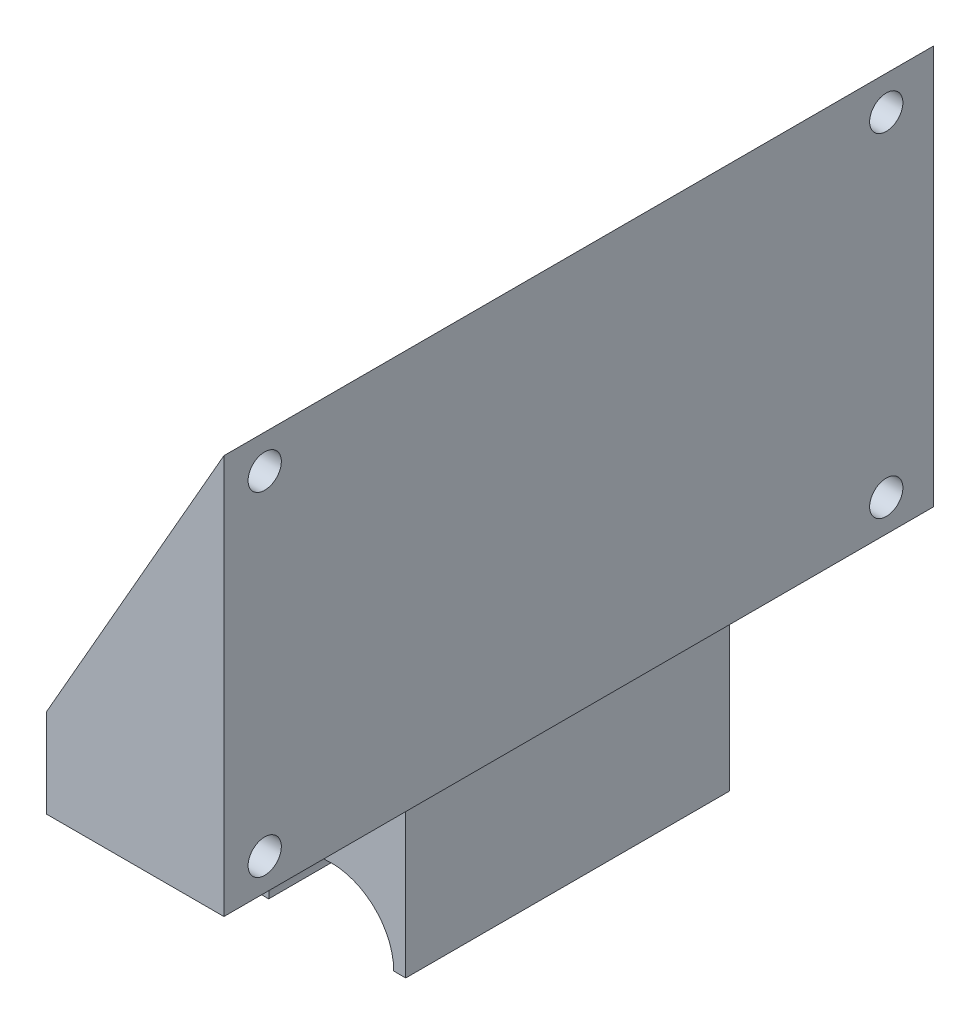
ISO-10303-21;
HEADER;
FILE_DESCRIPTION(('STEP AP214'),'2;1');
FILE_NAME('part.step','',(''),(''),'','','');
FILE_SCHEMA(('AUTOMOTIVE_DESIGN { 1 0 10303 214 1 1 1 1 }'));
ENDSEC;
DATA;
#1=APPLICATION_CONTEXT('core data for automotive mechanical design processes');
#2=APPLICATION_PROTOCOL_DEFINITION('international standard','automotive_design',2000,#1);
#3=PRODUCT_CONTEXT('',#1,'mechanical');
#4=PRODUCT('Part','Part','',(#3));
#5=PRODUCT_RELATED_PRODUCT_CATEGORY('part','',(#4));
#6=PRODUCT_DEFINITION_FORMATION('','',#4);
#7=PRODUCT_DEFINITION_CONTEXT('part definition',#1,'design');
#8=PRODUCT_DEFINITION('design','',#6,#7);
#9=PRODUCT_DEFINITION_SHAPE('','',#8);
#10=(LENGTH_UNIT() NAMED_UNIT(*) SI_UNIT(.MILLI.,.METRE.));
#11=(NAMED_UNIT(*) PLANE_ANGLE_UNIT() SI_UNIT($,.RADIAN.));
#12=(NAMED_UNIT(*) SI_UNIT($,.STERADIAN.) SOLID_ANGLE_UNIT());
#13=UNCERTAINTY_MEASURE_WITH_UNIT(LENGTH_MEASURE(1.E-05),#10,'distance_accuracy_value','');
#14=(GEOMETRIC_REPRESENTATION_CONTEXT(3) GLOBAL_UNCERTAINTY_ASSIGNED_CONTEXT((#13)) GLOBAL_UNIT_ASSIGNED_CONTEXT((#10,
#11,#12)) REPRESENTATION_CONTEXT('',''));
#15=CARTESIAN_POINT('',(0.,0.,0.));
#16=DIRECTION('',(0.,0.,1.));
#17=DIRECTION('',(1.,0.,0.));
#18=AXIS2_PLACEMENT_3D('',#15,#16,#17);
#19=CARTESIAN_POINT('',(0.,-22.225,0.));
#20=DIRECTION('',(0.,1.,0.));
#21=DIRECTION('',(0.,0.,1.));
#22=AXIS2_PLACEMENT_3D('',#19,#20,#21);
#23=PLANE('',#22);
#24=DIRECTION('',(0.,0.,1.));
#25=VECTOR('',#24,1.);
#26=CARTESIAN_POINT('',(22.098,-22.225,-330.709604062188));
#27=LINE('',#26,#25);
#28=CARTESIAN_POINT('',(22.098,-22.225,-73.9775));
#29=VERTEX_POINT('',#28);
#30=CARTESIAN_POINT('',(22.098,-22.225,-27.6225));
#31=VERTEX_POINT('',#30);
#32=EDGE_CURVE('E116',#29,#31,#27,.T.);
#33=ORIENTED_EDGE('',*,*,#32,.F.);
#34=DIRECTION('',(1.,0.,0.));
#35=VECTOR('',#34,1.);
#36=CARTESIAN_POINT('',(23.8125,-22.225,-73.9775));
#37=LINE('',#36,#35);
#38=CARTESIAN_POINT('',(23.8125,-22.225,-73.9775));
#39=VERTEX_POINT('',#38);
#40=EDGE_CURVE('E143',#29,#39,#37,.T.);
#41=ORIENTED_EDGE('',*,*,#40,.T.);
#42=DIRECTION('',(0.,0.,1.));
#43=VECTOR('',#42,1.);
#44=CARTESIAN_POINT('',(23.8125,-22.225,-27.6225));
#45=LINE('',#44,#43);
#46=CARTESIAN_POINT('',(23.8125,-22.225,-27.6225));
#47=VERTEX_POINT('',#46);
#48=EDGE_CURVE('E135',#39,#47,#45,.T.);
#49=ORIENTED_EDGE('',*,*,#48,.T.);
#50=DIRECTION('',(-1.,0.,0.));
#51=VECTOR('',#50,1.);
#52=CARTESIAN_POINT('',(23.8125,-22.225,-27.6225));
#53=LINE('',#52,#51);
#54=EDGE_CURVE('E134',#47,#31,#53,.T.);
#55=ORIENTED_EDGE('',*,*,#54,.T.);
#56=EDGE_LOOP('',(#33,#41,#49,#55));
#57=FACE_BOUND('',#56,.T.);
#58=ADVANCED_FACE('F39',(#57),#23,.F.);
#59=CARTESIAN_POINT('',(0.,0.,-101.6));
#60=DIRECTION('',(-1.,0.,0.));
#61=DIRECTION('',(0.,0.,1.));
#62=AXIS2_PLACEMENT_3D('',#59,#60,#61);
#63=PLANE('',#62);
#64=CARTESIAN_POINT('',(0.,4.572,-94.837878374074));
#65=DIRECTION('',(1.,0.,0.));
#66=DIRECTION('',(0.,1.,0.));
#67=AXIS2_PLACEMENT_3D('',#64,#65,#66);
#68=CIRCLE('',#67,2.38125000000001);
#69=CARTESIAN_POINT('',(0.,6.95325,-94.837878374074));
#70=VERTEX_POINT('',#69);
#71=EDGE_CURVE('E404',#70,#70,#68,.T.);
#72=ORIENTED_EDGE('',*,*,#71,.T.);
#73=EDGE_LOOP('',(#72));
#74=FACE_BOUND('',#73,.T.);
#75=CARTESIAN_POINT('',(0.,4.572,-5.842));
#76=DIRECTION('',(1.,0.,0.));
#77=DIRECTION('',(0.,1.,0.));
#78=AXIS2_PLACEMENT_3D('',#75,#76,#77);
#79=CIRCLE('',#78,2.38125);
#80=CARTESIAN_POINT('',(0.,6.95325,-5.842));
#81=VERTEX_POINT('',#80);
#82=EDGE_CURVE('E425',#81,#81,#79,.T.);
#83=ORIENTED_EDGE('',*,*,#82,.T.);
#84=EDGE_LOOP('',(#83));
#85=FACE_BOUND('',#84,.T.);
#86=DIRECTION('',(0.,-1.,0.));
#87=VECTOR('',#86,1.);
#88=CARTESIAN_POINT('',(0.,0.,0.));
#89=LINE('',#88,#87);
#90=CARTESIAN_POINT('',(0.,12.7,0.));
#91=VERTEX_POINT('',#90);
#92=CARTESIAN_POINT('',(0.,0.,0.));
#93=VERTEX_POINT('',#92);
#94=EDGE_CURVE('E162',#91,#93,#89,.T.);
#95=ORIENTED_EDGE('',*,*,#94,.F.);
#96=DIRECTION('',(0.,0.,1.));
#97=VECTOR('',#96,1.);
#98=CARTESIAN_POINT('',(0.,12.7,-101.6));
#99=LINE('',#98,#97);
#100=CARTESIAN_POINT('',(0.,12.7,-101.6));
#101=VERTEX_POINT('',#100);
#102=EDGE_CURVE('E47',#101,#91,#99,.T.);
#103=ORIENTED_EDGE('',*,*,#102,.F.);
#104=DIRECTION('',(0.,-1.,0.));
#105=VECTOR('',#104,1.);
#106=CARTESIAN_POINT('',(0.,0.,-101.6));
#107=LINE('',#106,#105);
#108=CARTESIAN_POINT('',(0.,0.,-101.6));
#109=VERTEX_POINT('',#108);
#110=EDGE_CURVE('E163',#101,#109,#107,.T.);
#111=ORIENTED_EDGE('',*,*,#110,.T.);
#112=DIRECTION('',(0.,0.,1.));
#113=VECTOR('',#112,1.);
#114=CARTESIAN_POINT('',(0.,0.,-101.6));
#115=LINE('',#114,#113);
#116=EDGE_CURVE('E176',#109,#93,#115,.T.);
#117=ORIENTED_EDGE('',*,*,#116,.T.);
#118=EDGE_LOOP('',(#95,#103,#111,#117));
#119=FACE_BOUND('',#118,.T.);
#120=ADVANCED_FACE('F41',(#74,#85,#119),#63,.T.);
#121=CARTESIAN_POINT('',(25.4,57.15,-101.6));
#122=DIRECTION('',(-0.868243142124459,0.496138938356834,0.));
#123=DIRECTION('',(-0.496138938356834,-0.868243142124459,0.));
#124=AXIS2_PLACEMENT_3D('',#121,#122,#123);
#125=PLANE('',#124);
#126=CARTESIAN_POINT('',(22.6422857142857,52.324,-94.837878374074));
#127=DIRECTION('',(-0.868243142124459,0.496138938356834,0.));
#128=DIRECTION('',(0.496138938356834,0.868243142124459,0.));
#129=AXIS2_PLACEMENT_3D('',#126,#127,#128);
#130=ELLIPSE('',#129,2.74260732330514,2.38125);
#131=CARTESIAN_POINT('',(24.003,54.70525,-94.837878374074));
#132=VERTEX_POINT('',#131);
#133=EDGE_CURVE('E401',#132,#132,#130,.T.);
#134=ORIENTED_EDGE('',*,*,#133,.F.);
#135=EDGE_LOOP('',(#134));
#136=FACE_BOUND('',#135,.T.);
#137=CARTESIAN_POINT('',(22.6422857142857,52.324,-5.842));
#138=DIRECTION('',(-0.868243142124459,0.496138938356834,0.));
#139=DIRECTION('',(0.496138938356834,0.868243142124459,0.));
#140=AXIS2_PLACEMENT_3D('',#137,#138,#139);
#141=ELLIPSE('',#140,2.74260732330513,2.38125);
#142=CARTESIAN_POINT('',(24.003,54.70525,-5.842));
#143=VERTEX_POINT('',#142);
#144=EDGE_CURVE('E414',#143,#143,#141,.T.);
#145=ORIENTED_EDGE('',*,*,#144,.F.);
#146=EDGE_LOOP('',(#145));
#147=FACE_BOUND('',#146,.T.);
#148=DIRECTION('',(-0.496138938356834,-0.868243142124459,0.));
#149=VECTOR('',#148,1.);
#150=CARTESIAN_POINT('',(25.4,57.15,0.));
#151=LINE('',#150,#149);
#152=CARTESIAN_POINT('',(25.4,57.15,0.));
#153=VERTEX_POINT('',#152);
#154=EDGE_CURVE('E167',#153,#91,#151,.T.);
#155=ORIENTED_EDGE('',*,*,#154,.F.);
#156=DIRECTION('',(0.,0.,1.));
#157=VECTOR('',#156,1.);
#158=CARTESIAN_POINT('',(25.4,57.15,-101.6));
#159=LINE('',#158,#157);
#160=CARTESIAN_POINT('',(25.4,57.15,-101.6));
#161=VERTEX_POINT('',#160);
#162=EDGE_CURVE('E188',#161,#153,#159,.T.);
#163=ORIENTED_EDGE('',*,*,#162,.F.);
#164=DIRECTION('',(-0.496138938356834,-0.868243142124459,0.));
#165=VECTOR('',#164,1.);
#166=CARTESIAN_POINT('',(25.4,57.15,-101.6));
#167=LINE('',#166,#165);
#168=EDGE_CURVE('E173',#161,#101,#167,.T.);
#169=ORIENTED_EDGE('',*,*,#168,.T.);
#170=ORIENTED_EDGE('',*,*,#102,.T.);
#171=EDGE_LOOP('',(#155,#163,#169,#170));
#172=FACE_BOUND('',#171,.T.);
#173=ADVANCED_FACE('F203',(#136,#147,#172),#125,.T.);
#174=CARTESIAN_POINT('',(25.4,57.15,-101.6));
#175=DIRECTION('',(1.,0.,0.));
#176=DIRECTION('',(0.,1.,0.));
#177=AXIS2_PLACEMENT_3D('',#174,#175,#176);
#178=PLANE('',#177);
#179=CARTESIAN_POINT('',(25.4,52.324,-94.837878374074));
#180=DIRECTION('',(1.,0.,0.));
#181=DIRECTION('',(0.,1.,0.));
#182=AXIS2_PLACEMENT_3D('',#179,#180,#181);
#183=CIRCLE('',#182,2.38125);
#184=CARTESIAN_POINT('',(25.4,54.70525,-94.837878374074));
#185=VERTEX_POINT('',#184);
#186=EDGE_CURVE('E403',#185,#185,#183,.T.);
#187=ORIENTED_EDGE('',*,*,#186,.F.);
#188=EDGE_LOOP('',(#187));
#189=FACE_BOUND('',#188,.T.);
#190=CARTESIAN_POINT('',(25.4,4.572,-94.837878374074));
#191=DIRECTION('',(1.,0.,0.));
#192=DIRECTION('',(0.,1.,0.));
#193=AXIS2_PLACEMENT_3D('',#190,#191,#192);
#194=CIRCLE('',#193,2.38125000000001);
#195=CARTESIAN_POINT('',(25.4,6.95325,-94.837878374074));
#196=VERTEX_POINT('',#195);
#197=EDGE_CURVE('E407',#196,#196,#194,.T.);
#198=ORIENTED_EDGE('',*,*,#197,.F.);
#199=EDGE_LOOP('',(#198));
#200=FACE_BOUND('',#199,.T.);
#201=CARTESIAN_POINT('',(25.4,4.572,-5.842));
#202=DIRECTION('',(1.,0.,0.));
#203=DIRECTION('',(0.,1.,0.));
#204=AXIS2_PLACEMENT_3D('',#201,#202,#203);
#205=CIRCLE('',#204,2.38125);
#206=CARTESIAN_POINT('',(25.4,6.95325,-5.842));
#207=VERTEX_POINT('',#206);
#208=EDGE_CURVE('E415',#207,#207,#205,.T.);
#209=ORIENTED_EDGE('',*,*,#208,.F.);
#210=EDGE_LOOP('',(#209));
#211=FACE_BOUND('',#210,.T.);
#212=CARTESIAN_POINT('',(25.4,52.324,-5.842));
#213=DIRECTION('',(1.,0.,0.));
#214=DIRECTION('',(0.,1.,0.));
#215=AXIS2_PLACEMENT_3D('',#212,#213,#214);
#216=CIRCLE('',#215,2.38125);
#217=CARTESIAN_POINT('',(25.4,54.70525,-5.842));
#218=VERTEX_POINT('',#217);
#219=EDGE_CURVE('E411',#218,#218,#216,.T.);
#220=ORIENTED_EDGE('',*,*,#219,.F.);
#221=EDGE_LOOP('',(#220));
#222=FACE_BOUND('',#221,.T.);
#223=DIRECTION('',(0.,1.,0.));
#224=VECTOR('',#223,1.);
#225=CARTESIAN_POINT('',(25.4,57.15,0.));
#226=LINE('',#225,#224);
#227=CARTESIAN_POINT('',(25.4,0.,0.));
#228=VERTEX_POINT('',#227);
#229=EDGE_CURVE('E182',#228,#153,#226,.T.);
#230=ORIENTED_EDGE('',*,*,#229,.F.);
#231=DIRECTION('',(0.,0.,1.));
#232=VECTOR('',#231,1.);
#233=CARTESIAN_POINT('',(25.4,0.,-101.6));
#234=LINE('',#233,#232);
#235=CARTESIAN_POINT('',(25.4,0.,-101.6));
#236=VERTEX_POINT('',#235);
#237=EDGE_CURVE('E190',#236,#228,#234,.T.);
#238=ORIENTED_EDGE('',*,*,#237,.F.);
#239=DIRECTION('',(0.,1.,0.));
#240=VECTOR('',#239,1.);
#241=CARTESIAN_POINT('',(25.4,57.15,-101.6));
#242=LINE('',#241,#240);
#243=EDGE_CURVE('E170',#236,#161,#242,.T.);
#244=ORIENTED_EDGE('',*,*,#243,.T.);
#245=ORIENTED_EDGE('',*,*,#162,.T.);
#246=EDGE_LOOP('',(#230,#238,#244,#245));
#247=FACE_BOUND('',#246,.T.);
#248=ADVANCED_FACE('F209',(#189,#200,#211,#222,#247),#178,.T.);
#249=CARTESIAN_POINT('',(0.,0.,-101.6));
#250=DIRECTION('',(0.,-1.,0.));
#251=DIRECTION('',(0.,0.,-1.));
#252=AXIS2_PLACEMENT_3D('',#249,#250,#251);
#253=PLANE('',#252);
#254=DIRECTION('',(0.,0.,1.));
#255=VECTOR('',#254,1.);
#256=CARTESIAN_POINT('',(23.8125,0.,-27.6225));
#257=LINE('',#256,#255);
#258=CARTESIAN_POINT('',(23.8125,0.,-73.9775));
#259=VERTEX_POINT('',#258);
#260=CARTESIAN_POINT('',(23.8125,0.,-27.6225));
#261=VERTEX_POINT('',#260);
#262=EDGE_CURVE('E61',#259,#261,#257,.T.);
#263=ORIENTED_EDGE('',*,*,#262,.F.);
#264=DIRECTION('',(1.,0.,0.));
#265=VECTOR('',#264,1.);
#266=CARTESIAN_POINT('',(23.8125,0.,-73.9775));
#267=LINE('',#266,#265);
#268=CARTESIAN_POINT('',(2.4765,0.,-73.9775));
#269=VERTEX_POINT('',#268);
#270=EDGE_CURVE('E139',#269,#259,#267,.T.);
#271=ORIENTED_EDGE('',*,*,#270,.F.);
#272=DIRECTION('',(0.,0.,-1.));
#273=VECTOR('',#272,1.);
#274=CARTESIAN_POINT('',(2.4765,0.,-27.6225));
#275=LINE('',#274,#273);
#276=CARTESIAN_POINT('',(2.4765,0.,-27.6225));
#277=VERTEX_POINT('',#276);
#278=EDGE_CURVE('E149',#277,#269,#275,.T.);
#279=ORIENTED_EDGE('',*,*,#278,.F.);
#280=DIRECTION('',(-1.,0.,0.));
#281=VECTOR('',#280,1.);
#282=CARTESIAN_POINT('',(23.8125,0.,-27.6225));
#283=LINE('',#282,#281);
#284=EDGE_CURVE('E147',#261,#277,#283,.T.);
#285=ORIENTED_EDGE('',*,*,#284,.F.);
#286=EDGE_LOOP('',(#263,#271,#279,#285));
#287=FACE_BOUND('',#286,.T.);
#288=DIRECTION('',(1.,0.,0.));
#289=VECTOR('',#288,1.);
#290=CARTESIAN_POINT('',(0.,0.,0.));
#291=LINE('',#290,#289);
#292=EDGE_CURVE('E179',#93,#228,#291,.T.);
#293=ORIENTED_EDGE('',*,*,#292,.F.);
#294=ORIENTED_EDGE('',*,*,#116,.F.);
#295=DIRECTION('',(1.,0.,0.));
#296=VECTOR('',#295,1.);
#297=CARTESIAN_POINT('',(0.,0.,-101.6));
#298=LINE('',#297,#296);
#299=EDGE_CURVE('E166',#109,#236,#298,.T.);
#300=ORIENTED_EDGE('',*,*,#299,.T.);
#301=ORIENTED_EDGE('',*,*,#237,.T.);
#302=EDGE_LOOP('',(#293,#294,#300,#301));
#303=FACE_BOUND('',#302,.T.);
#304=ADVANCED_FACE('F197',(#287,#303),#253,.T.);
#305=CARTESIAN_POINT('',(0.,0.,-101.6));
#306=DIRECTION('',(0.,0.,-1.));
#307=DIRECTION('',(-1.,0.,0.));
#308=AXIS2_PLACEMENT_3D('',#305,#306,#307);
#309=PLANE('',#308);
#310=ORIENTED_EDGE('',*,*,#110,.F.);
#311=ORIENTED_EDGE('',*,*,#168,.F.);
#312=ORIENTED_EDGE('',*,*,#243,.F.);
#313=ORIENTED_EDGE('',*,*,#299,.F.);
#314=EDGE_LOOP('',(#310,#311,#312,#313));
#315=FACE_BOUND('',#314,.T.);
#316=ADVANCED_FACE('F206',(#315),#309,.T.);
#317=CARTESIAN_POINT('',(0.,0.,0.));
#318=DIRECTION('',(0.,0.,-1.));
#319=DIRECTION('',(-1.,0.,0.));
#320=AXIS2_PLACEMENT_3D('',#317,#318,#319);
#321=PLANE('',#320);
#322=ORIENTED_EDGE('',*,*,#94,.T.);
#323=ORIENTED_EDGE('',*,*,#292,.T.);
#324=ORIENTED_EDGE('',*,*,#229,.T.);
#325=ORIENTED_EDGE('',*,*,#154,.T.);
#326=EDGE_LOOP('',(#322,#323,#324,#325));
#327=FACE_BOUND('',#326,.T.);
#328=ADVANCED_FACE('F200',(#327),#321,.F.);
#329=CARTESIAN_POINT('',(23.8125,-22.225,-27.6225));
#330=DIRECTION('',(-1.,0.,0.));
#331=DIRECTION('',(0.,0.,1.));
#332=AXIS2_PLACEMENT_3D('',#329,#330,#331);
#333=PLANE('',#332);
#334=ORIENTED_EDGE('',*,*,#262,.T.);
#335=DIRECTION('',(0.,1.,0.));
#336=VECTOR('',#335,1.);
#337=CARTESIAN_POINT('',(23.8125,-22.225,-27.6225));
#338=LINE('',#337,#336);
#339=EDGE_CURVE('E159',#47,#261,#338,.T.);
#340=ORIENTED_EDGE('',*,*,#339,.F.);
#341=ORIENTED_EDGE('',*,*,#48,.F.);
#342=DIRECTION('',(0.,1.,0.));
#343=VECTOR('',#342,1.);
#344=CARTESIAN_POINT('',(23.8125,-22.225,-73.9775));
#345=LINE('',#344,#343);
#346=EDGE_CURVE('E145',#39,#259,#345,.T.);
#347=ORIENTED_EDGE('',*,*,#346,.T.);
#348=EDGE_LOOP('',(#334,#340,#341,#347));
#349=FACE_BOUND('',#348,.T.);
#350=ADVANCED_FACE('F250',(#349),#333,.F.);
#351=CARTESIAN_POINT('',(23.8125,-22.225,-27.6225));
#352=DIRECTION('',(0.,0.,-1.));
#353=DIRECTION('',(-1.,0.,0.));
#354=AXIS2_PLACEMENT_3D('',#351,#352,#353);
#355=PLANE('',#354);
#356=CARTESIAN_POINT('',(4.191,-22.225,-27.6225));
#357=VERTEX_POINT('',#356);
#358=CARTESIAN_POINT('',(2.4765,-22.225,-27.6225));
#359=VERTEX_POINT('',#358);
#360=EDGE_CURVE('E124',#357,#359,#53,.T.);
#361=ORIENTED_EDGE('',*,*,#360,.F.);
#362=CARTESIAN_POINT('',(13.1445,-22.225,-27.6225));
#363=DIRECTION('',(0.,0.,-1.));
#364=DIRECTION('',(-1.,0.,0.));
#365=AXIS2_PLACEMENT_3D('',#362,#363,#364);
#366=CIRCLE('',#365,8.9535);
#367=EDGE_CURVE('E113',#357,#31,#366,.T.);
#368=ORIENTED_EDGE('',*,*,#367,.T.);
#369=ORIENTED_EDGE('',*,*,#54,.F.);
#370=ORIENTED_EDGE('',*,*,#339,.T.);
#371=ORIENTED_EDGE('',*,*,#284,.T.);
#372=DIRECTION('',(0.,1.,0.));
#373=VECTOR('',#372,1.);
#374=CARTESIAN_POINT('',(2.4765,-22.225,-27.6225));
#375=LINE('',#374,#373);
#376=EDGE_CURVE('E132',#359,#277,#375,.T.);
#377=ORIENTED_EDGE('',*,*,#376,.F.);
#378=EDGE_LOOP('',(#361,#368,#369,#370,#371,#377));
#379=FACE_BOUND('',#378,.T.);
#380=ADVANCED_FACE('F129',(#379),#355,.F.);
#381=CARTESIAN_POINT('',(2.4765,-22.225,-27.6225));
#382=DIRECTION('',(1.,0.,0.));
#383=DIRECTION('',(0.,0.,-1.));
#384=AXIS2_PLACEMENT_3D('',#381,#382,#383);
#385=PLANE('',#384);
#386=ORIENTED_EDGE('',*,*,#278,.T.);
#387=DIRECTION('',(0.,1.,0.));
#388=VECTOR('',#387,1.);
#389=CARTESIAN_POINT('',(2.4765,-22.225,-73.9775));
#390=LINE('',#389,#388);
#391=CARTESIAN_POINT('',(2.4765,-22.225,-73.9775));
#392=VERTEX_POINT('',#391);
#393=EDGE_CURVE('E155',#392,#269,#390,.T.);
#394=ORIENTED_EDGE('',*,*,#393,.F.);
#395=DIRECTION('',(0.,0.,-1.));
#396=VECTOR('',#395,1.);
#397=CARTESIAN_POINT('',(2.4765,-22.225,-27.6225));
#398=LINE('',#397,#396);
#399=EDGE_CURVE('E137',#359,#392,#398,.T.);
#400=ORIENTED_EDGE('',*,*,#399,.F.);
#401=ORIENTED_EDGE('',*,*,#376,.T.);
#402=EDGE_LOOP('',(#386,#394,#400,#401));
#403=FACE_BOUND('',#402,.T.);
#404=ADVANCED_FACE('F239',(#403),#385,.F.);
#405=CARTESIAN_POINT('',(23.8125,-22.225,-73.9775));
#406=DIRECTION('',(0.,0.,1.));
#407=DIRECTION('',(1.,0.,0.));
#408=AXIS2_PLACEMENT_3D('',#405,#406,#407);
#409=PLANE('',#408);
#410=ORIENTED_EDGE('',*,*,#40,.F.);
#411=CARTESIAN_POINT('',(13.1445,-22.225,-73.9775));
#412=DIRECTION('',(0.,0.,1.));
#413=DIRECTION('',(1.,0.,0.));
#414=AXIS2_PLACEMENT_3D('',#411,#412,#413);
#415=CIRCLE('',#414,8.9535);
#416=CARTESIAN_POINT('',(4.191,-22.225,-73.9775));
#417=VERTEX_POINT('',#416);
#418=EDGE_CURVE('E11',#29,#417,#415,.T.);
#419=ORIENTED_EDGE('',*,*,#418,.T.);
#420=EDGE_CURVE('E127',#392,#417,#37,.T.);
#421=ORIENTED_EDGE('',*,*,#420,.F.);
#422=ORIENTED_EDGE('',*,*,#393,.T.);
#423=ORIENTED_EDGE('',*,*,#270,.T.);
#424=ORIENTED_EDGE('',*,*,#346,.F.);
#425=EDGE_LOOP('',(#410,#419,#421,#422,#423,#424));
#426=FACE_BOUND('',#425,.T.);
#427=ADVANCED_FACE('F233',(#426),#409,.F.);
#428=ORIENTED_EDGE('',*,*,#420,.T.);
#429=DIRECTION('',(0.,0.,1.));
#430=VECTOR('',#429,1.);
#431=CARTESIAN_POINT('',(4.191,-22.225,-330.709604062188));
#432=LINE('',#431,#430);
#433=EDGE_CURVE('E54',#417,#357,#432,.T.);
#434=ORIENTED_EDGE('',*,*,#433,.T.);
#435=ORIENTED_EDGE('',*,*,#360,.T.);
#436=ORIENTED_EDGE('',*,*,#399,.T.);
#437=EDGE_LOOP('',(#428,#434,#435,#436));
#438=FACE_BOUND('',#437,.T.);
#439=ADVANCED_FACE('F123',(#438),#23,.F.);
#440=CARTESIAN_POINT('',(13.1445,-22.225,-330.709604062188));
#441=DIRECTION('',(0.,0.,1.));
#442=DIRECTION('',(1.,0.,0.));
#443=AXIS2_PLACEMENT_3D('',#440,#441,#442);
#444=CYLINDRICAL_SURFACE('',#443,8.9535);
#445=ORIENTED_EDGE('',*,*,#367,.F.);
#446=ORIENTED_EDGE('',*,*,#433,.F.);
#447=ORIENTED_EDGE('',*,*,#418,.F.);
#448=ORIENTED_EDGE('',*,*,#32,.T.);
#449=EDGE_LOOP('',(#445,#446,#447,#448));
#450=FACE_BOUND('',#449,.T.);
#451=ADVANCED_FACE('F114',(#450),#444,.F.);
#452=CARTESIAN_POINT('',(0.,52.324,-5.842));
#453=DIRECTION('',(1.,0.,0.));
#454=DIRECTION('',(0.,1.,0.));
#455=AXIS2_PLACEMENT_3D('',#452,#453,#454);
#456=CYLINDRICAL_SURFACE('',#455,2.38125);
#457=ORIENTED_EDGE('',*,*,#144,.T.);
#458=EDGE_LOOP('',(#457));
#459=FACE_BOUND('',#458,.T.);
#460=ORIENTED_EDGE('',*,*,#219,.T.);
#461=EDGE_LOOP('',(#460));
#462=FACE_BOUND('',#461,.T.);
#463=ADVANCED_FACE('F238',(#459,#462),#456,.F.);
#464=CARTESIAN_POINT('',(0.,4.572,-5.842));
#465=DIRECTION('',(1.,0.,0.));
#466=DIRECTION('',(0.,1.,0.));
#467=AXIS2_PLACEMENT_3D('',#464,#465,#466);
#468=CYLINDRICAL_SURFACE('',#467,2.38125);
#469=CARTESIAN_POINT('',(0.,6.95325,-5.842));
#470=CARTESIAN_POINT('',(0.26458333333333,6.95325,-5.842));
#471=CARTESIAN_POINT('',(0.529166666666663,6.95325,-5.842));
#472=CARTESIAN_POINT('',(1.05833333333333,6.95325,-5.842));
#473=CARTESIAN_POINT('',(1.32291666666666,6.95325,-5.842));
#474=CARTESIAN_POINT('',(1.85208333333333,6.95325,-5.842));
#475=CARTESIAN_POINT('',(2.11666666666666,6.95325,-5.842));
#476=CARTESIAN_POINT('',(2.64583333333333,6.95325,-5.842));
#477=CARTESIAN_POINT('',(2.91041666666666,6.95325,-5.842));
#478=CARTESIAN_POINT('',(3.43958333333333,6.95325,-5.842));
#479=CARTESIAN_POINT('',(3.70416666666666,6.95325,-5.842));
#480=CARTESIAN_POINT('',(4.23333333333333,6.95325,-5.842));
#481=CARTESIAN_POINT('',(4.49791666666666,6.95325,-5.842));
#482=CARTESIAN_POINT('',(5.02708333333333,6.95325,-5.842));
#483=CARTESIAN_POINT('',(5.29166666666666,6.95325,-5.842));
#484=CARTESIAN_POINT('',(5.82083333333333,6.95325,-5.842));
#485=CARTESIAN_POINT('',(6.08541666666666,6.95325,-5.842));
#486=CARTESIAN_POINT('',(6.61458333333333,6.95325,-5.842));
#487=CARTESIAN_POINT('',(6.87916666666666,6.95325,-5.842));
#488=CARTESIAN_POINT('',(7.40833333333333,6.95325,-5.842));
#489=CARTESIAN_POINT('',(7.67291666666666,6.95325,-5.842));
#490=CARTESIAN_POINT('',(8.20208333333333,6.95325,-5.842));
#491=CARTESIAN_POINT('',(8.46666666666666,6.95325,-5.842));
#492=CARTESIAN_POINT('',(8.99583333333333,6.95325,-5.842));
#493=CARTESIAN_POINT('',(9.26041666666666,6.95325,-5.842));
#494=CARTESIAN_POINT('',(9.78958333333333,6.95325,-5.842));
#495=CARTESIAN_POINT('',(10.0541666666667,6.95325,-5.842));
#496=CARTESIAN_POINT('',(10.5833333333333,6.95325,-5.842));
#497=CARTESIAN_POINT('',(10.8479166666667,6.95325,-5.842));
#498=CARTESIAN_POINT('',(11.3770833333333,6.95325,-5.842));
#499=CARTESIAN_POINT('',(11.6416666666667,6.95325,-5.842));
#500=CARTESIAN_POINT('',(12.1708333333333,6.95325,-5.842));
#501=CARTESIAN_POINT('',(12.4354166666667,6.95325,-5.842));
#502=CARTESIAN_POINT('',(12.9645833333333,6.95325,-5.842));
#503=CARTESIAN_POINT('',(13.2291666666667,6.95325,-5.842));
#504=CARTESIAN_POINT('',(13.7583333333333,6.95325,-5.842));
#505=CARTESIAN_POINT('',(14.0229166666667,6.95325,-5.842));
#506=CARTESIAN_POINT('',(14.5520833333333,6.95325,-5.842));
#507=CARTESIAN_POINT('',(14.8166666666667,6.95325,-5.842));
#508=CARTESIAN_POINT('',(15.3458333333333,6.95325,-5.842));
#509=CARTESIAN_POINT('',(15.6104166666667,6.95325,-5.842));
#510=CARTESIAN_POINT('',(16.1395833333333,6.95325,-5.842));
#511=CARTESIAN_POINT('',(16.4041666666667,6.95325,-5.842));
#512=CARTESIAN_POINT('',(16.9333333333333,6.95325,-5.842));
#513=CARTESIAN_POINT('',(17.1979166666667,6.95325,-5.842));
#514=CARTESIAN_POINT('',(17.7270833333333,6.95325,-5.842));
#515=CARTESIAN_POINT('',(17.9916666666667,6.95325,-5.842));
#516=CARTESIAN_POINT('',(18.5208333333333,6.95325,-5.842));
#517=CARTESIAN_POINT('',(18.7854166666667,6.95325,-5.842));
#518=CARTESIAN_POINT('',(19.3145833333333,6.95325,-5.842));
#519=CARTESIAN_POINT('',(19.5791666666667,6.95325,-5.842));
#520=CARTESIAN_POINT('',(20.1083333333333,6.95325,-5.842));
#521=CARTESIAN_POINT('',(20.3729166666667,6.95325,-5.842));
#522=CARTESIAN_POINT('',(20.9020833333333,6.95325,-5.842));
#523=CARTESIAN_POINT('',(21.1666666666667,6.95325,-5.842));
#524=CARTESIAN_POINT('',(21.6958333333333,6.95325,-5.842));
#525=CARTESIAN_POINT('',(21.9604166666667,6.95325,-5.842));
#526=CARTESIAN_POINT('',(22.4895833333333,6.95325,-5.842));
#527=CARTESIAN_POINT('',(22.7541666666667,6.95325,-5.842));
#528=CARTESIAN_POINT('',(23.2833333333333,6.95325,-5.842));
#529=CARTESIAN_POINT('',(23.5479166666667,6.95325,-5.842));
#530=CARTESIAN_POINT('',(24.0770833333333,6.95325,-5.842));
#531=CARTESIAN_POINT('',(24.3416666666667,6.95325,-5.842));
#532=CARTESIAN_POINT('',(24.8708333333333,6.95325,-5.842));
#533=CARTESIAN_POINT('',(25.1354166666667,6.95325,-5.842));
#534=CARTESIAN_POINT('',(25.4,6.95325,-5.842));
#535=B_SPLINE_CURVE_WITH_KNOTS('',3,(#469,#470,#471,#472,#473,#474,#475,#476,#477,#478,#479,
#480,#481,#482,#483,#484,#485,#486,#487,#488,#489,#490,#491,#492,#493,#494,#495,#496,#497,#498,
#499,#500,#501,#502,#503,#504,#505,#506,#507,#508,#509,#510,#511,#512,#513,#514,#515,#516,#517,
#518,#519,#520,#521,#522,#523,#524,#525,#526,#527,#528,#529,#530,#531,#532,#533,#534),
.UNSPECIFIED.,.F.,.F.,(4,2,2,2,2,2,2,2,2,2,2,2,2,2,2,2,2,2,2,2,2,2,2,2,2,2,2,2,2,2,2,2,4),(0.,
0.79375,1.5875,2.38125,3.175,3.96875,4.7625,5.55625,6.35,7.14375,7.9375,8.73125,9.525,10.31875,
11.1125,11.90625,12.7,13.49375,14.2875,15.08125,15.875,16.66875,17.4625,18.25625,19.05,19.84375,
20.6375,21.43125,22.225,23.01875,23.8125,24.60625,25.4),.UNSPECIFIED.);
#536=EDGE_CURVE('BSEAM301',#81,#207,#535,.T.);
#537=ORIENTED_EDGE('',*,*,#82,.F.);
#538=ORIENTED_EDGE('',*,*,#208,.T.);
#539=ORIENTED_EDGE('',*,*,#536,.T.);
#540=ORIENTED_EDGE('',*,*,#536,.F.);
#541=EDGE_LOOP('',(#537,#539,#538,#540));
#542=FACE_BOUND('',#541,.T.);
#543=ADVANCED_FACE('F301',(#542),#468,.F.);
#544=CARTESIAN_POINT('',(0.,4.572,-94.837878374074));
#545=DIRECTION('',(1.,0.,0.));
#546=DIRECTION('',(0.,1.,0.));
#547=AXIS2_PLACEMENT_3D('',#544,#545,#546);
#548=CYLINDRICAL_SURFACE('',#547,2.38125000000001);
#549=CARTESIAN_POINT('',(0.,6.95325,-94.837878374074));
#550=CARTESIAN_POINT('',(0.26458333333333,6.95325,-94.837878374074));
#551=CARTESIAN_POINT('',(0.529166666666663,6.95325,-94.837878374074));
#552=CARTESIAN_POINT('',(1.05833333333333,6.95325,-94.837878374074));
#553=CARTESIAN_POINT('',(1.32291666666666,6.95325,-94.837878374074));
#554=CARTESIAN_POINT('',(1.85208333333333,6.95325,-94.837878374074));
#555=CARTESIAN_POINT('',(2.11666666666666,6.95325,-94.837878374074));
#556=CARTESIAN_POINT('',(2.64583333333333,6.95325,-94.837878374074));
#557=CARTESIAN_POINT('',(2.91041666666666,6.95325,-94.837878374074));
#558=CARTESIAN_POINT('',(3.43958333333333,6.95325,-94.837878374074));
#559=CARTESIAN_POINT('',(3.70416666666666,6.95325,-94.837878374074));
#560=CARTESIAN_POINT('',(4.23333333333333,6.95325,-94.837878374074));
#561=CARTESIAN_POINT('',(4.49791666666666,6.95325,-94.837878374074));
#562=CARTESIAN_POINT('',(5.02708333333333,6.95325,-94.837878374074));
#563=CARTESIAN_POINT('',(5.29166666666666,6.95325,-94.837878374074));
#564=CARTESIAN_POINT('',(5.82083333333333,6.95325,-94.837878374074));
#565=CARTESIAN_POINT('',(6.08541666666666,6.95325,-94.837878374074));
#566=CARTESIAN_POINT('',(6.61458333333333,6.95325,-94.837878374074));
#567=CARTESIAN_POINT('',(6.87916666666666,6.95325,-94.837878374074));
#568=CARTESIAN_POINT('',(7.40833333333333,6.95325,-94.837878374074));
#569=CARTESIAN_POINT('',(7.67291666666666,6.95325,-94.837878374074));
#570=CARTESIAN_POINT('',(8.20208333333333,6.95325,-94.837878374074));
#571=CARTESIAN_POINT('',(8.46666666666666,6.95325,-94.837878374074));
#572=CARTESIAN_POINT('',(8.99583333333333,6.95325,-94.837878374074));
#573=CARTESIAN_POINT('',(9.26041666666666,6.95325,-94.837878374074));
#574=CARTESIAN_POINT('',(9.78958333333333,6.95325,-94.837878374074));
#575=CARTESIAN_POINT('',(10.0541666666667,6.95325,-94.837878374074));
#576=CARTESIAN_POINT('',(10.5833333333333,6.95325,-94.837878374074));
#577=CARTESIAN_POINT('',(10.8479166666667,6.95325,-94.837878374074));
#578=CARTESIAN_POINT('',(11.3770833333333,6.95325,-94.837878374074));
#579=CARTESIAN_POINT('',(11.6416666666667,6.95325,-94.837878374074));
#580=CARTESIAN_POINT('',(12.1708333333333,6.95325,-94.837878374074));
#581=CARTESIAN_POINT('',(12.4354166666667,6.95325,-94.837878374074));
#582=CARTESIAN_POINT('',(12.9645833333333,6.95325,-94.837878374074));
#583=CARTESIAN_POINT('',(13.2291666666667,6.95325,-94.837878374074));
#584=CARTESIAN_POINT('',(13.7583333333333,6.95325,-94.837878374074));
#585=CARTESIAN_POINT('',(14.0229166666667,6.95325,-94.837878374074));
#586=CARTESIAN_POINT('',(14.5520833333333,6.95325,-94.837878374074));
#587=CARTESIAN_POINT('',(14.8166666666667,6.95325,-94.837878374074));
#588=CARTESIAN_POINT('',(15.3458333333333,6.95325,-94.837878374074));
#589=CARTESIAN_POINT('',(15.6104166666667,6.95325,-94.837878374074));
#590=CARTESIAN_POINT('',(16.1395833333333,6.95325,-94.837878374074));
#591=CARTESIAN_POINT('',(16.4041666666667,6.95325,-94.837878374074));
#592=CARTESIAN_POINT('',(16.9333333333333,6.95325,-94.837878374074));
#593=CARTESIAN_POINT('',(17.1979166666667,6.95325,-94.837878374074));
#594=CARTESIAN_POINT('',(17.7270833333333,6.95325,-94.837878374074));
#595=CARTESIAN_POINT('',(17.9916666666667,6.95325,-94.837878374074));
#596=CARTESIAN_POINT('',(18.5208333333333,6.95325,-94.837878374074));
#597=CARTESIAN_POINT('',(18.7854166666667,6.95325,-94.837878374074));
#598=CARTESIAN_POINT('',(19.3145833333333,6.95325,-94.837878374074));
#599=CARTESIAN_POINT('',(19.5791666666667,6.95325,-94.837878374074));
#600=CARTESIAN_POINT('',(20.1083333333333,6.95325,-94.837878374074));
#601=CARTESIAN_POINT('',(20.3729166666667,6.95325,-94.837878374074));
#602=CARTESIAN_POINT('',(20.9020833333333,6.95325,-94.837878374074));
#603=CARTESIAN_POINT('',(21.1666666666667,6.95325,-94.837878374074));
#604=CARTESIAN_POINT('',(21.6958333333333,6.95325,-94.837878374074));
#605=CARTESIAN_POINT('',(21.9604166666667,6.95325,-94.837878374074));
#606=CARTESIAN_POINT('',(22.4895833333333,6.95325,-94.837878374074));
#607=CARTESIAN_POINT('',(22.7541666666667,6.95325,-94.837878374074));
#608=CARTESIAN_POINT('',(23.2833333333333,6.95325,-94.837878374074));
#609=CARTESIAN_POINT('',(23.5479166666667,6.95325,-94.837878374074));
#610=CARTESIAN_POINT('',(24.0770833333333,6.95325,-94.837878374074));
#611=CARTESIAN_POINT('',(24.3416666666667,6.95325,-94.837878374074));
#612=CARTESIAN_POINT('',(24.8708333333333,6.95325,-94.837878374074));
#613=CARTESIAN_POINT('',(25.1354166666667,6.95325,-94.837878374074));
#614=CARTESIAN_POINT('',(25.4,6.95325,-94.837878374074));
#615=B_SPLINE_CURVE_WITH_KNOTS('',3,(#549,#550,#551,#552,#553,#554,#555,#556,#557,#558,#559,
#560,#561,#562,#563,#564,#565,#566,#567,#568,#569,#570,#571,#572,#573,#574,#575,#576,#577,#578,
#579,#580,#581,#582,#583,#584,#585,#586,#587,#588,#589,#590,#591,#592,#593,#594,#595,#596,#597,
#598,#599,#600,#601,#602,#603,#604,#605,#606,#607,#608,#609,#610,#611,#612,#613,#614),
.UNSPECIFIED.,.F.,.F.,(4,2,2,2,2,2,2,2,2,2,2,2,2,2,2,2,2,2,2,2,2,2,2,2,2,2,2,2,2,2,2,2,4),(0.,
0.79375,1.5875,2.38125,3.175,3.96875,4.7625,5.55625,6.35,7.14375,7.9375,8.73125,9.525,10.31875,
11.1125,11.90625,12.7,13.49375,14.2875,15.08125,15.875,16.66875,17.4625,18.25625,19.05,19.84375,
20.6375,21.43125,22.225,23.01875,23.8125,24.60625,25.4),.UNSPECIFIED.);
#616=EDGE_CURVE('BSEAM310',#70,#196,#615,.T.);
#617=ORIENTED_EDGE('',*,*,#71,.F.);
#618=ORIENTED_EDGE('',*,*,#197,.T.);
#619=ORIENTED_EDGE('',*,*,#616,.T.);
#620=ORIENTED_EDGE('',*,*,#616,.F.);
#621=EDGE_LOOP('',(#617,#619,#618,#620));
#622=FACE_BOUND('',#621,.T.);
#623=ADVANCED_FACE('F310',(#622),#548,.F.);
#624=CARTESIAN_POINT('',(0.,52.324,-94.837878374074));
#625=DIRECTION('',(1.,0.,0.));
#626=DIRECTION('',(0.,1.,0.));
#627=AXIS2_PLACEMENT_3D('',#624,#625,#626);
#628=CYLINDRICAL_SURFACE('',#627,2.38125);
#629=ORIENTED_EDGE('',*,*,#133,.T.);
#630=EDGE_LOOP('',(#629));
#631=FACE_BOUND('',#630,.T.);
#632=ORIENTED_EDGE('',*,*,#186,.T.);
#633=EDGE_LOOP('',(#632));
#634=FACE_BOUND('',#633,.T.);
#635=ADVANCED_FACE('F320',(#631,#634),#628,.F.);
#636=CLOSED_SHELL('',(#58,#120,#173,#248,#304,#316,#328,#350,#380,#404,#427,#439,#451,#463,#543,
#623,#635));
#637=MANIFOLD_SOLID_BREP('B2',#636);
#638=ADVANCED_BREP_SHAPE_REPRESENTATION('',(#18,#637),#14);
#639=SHAPE_DEFINITION_REPRESENTATION(#9,#638);
ENDSEC;
END-ISO-10303-21;
